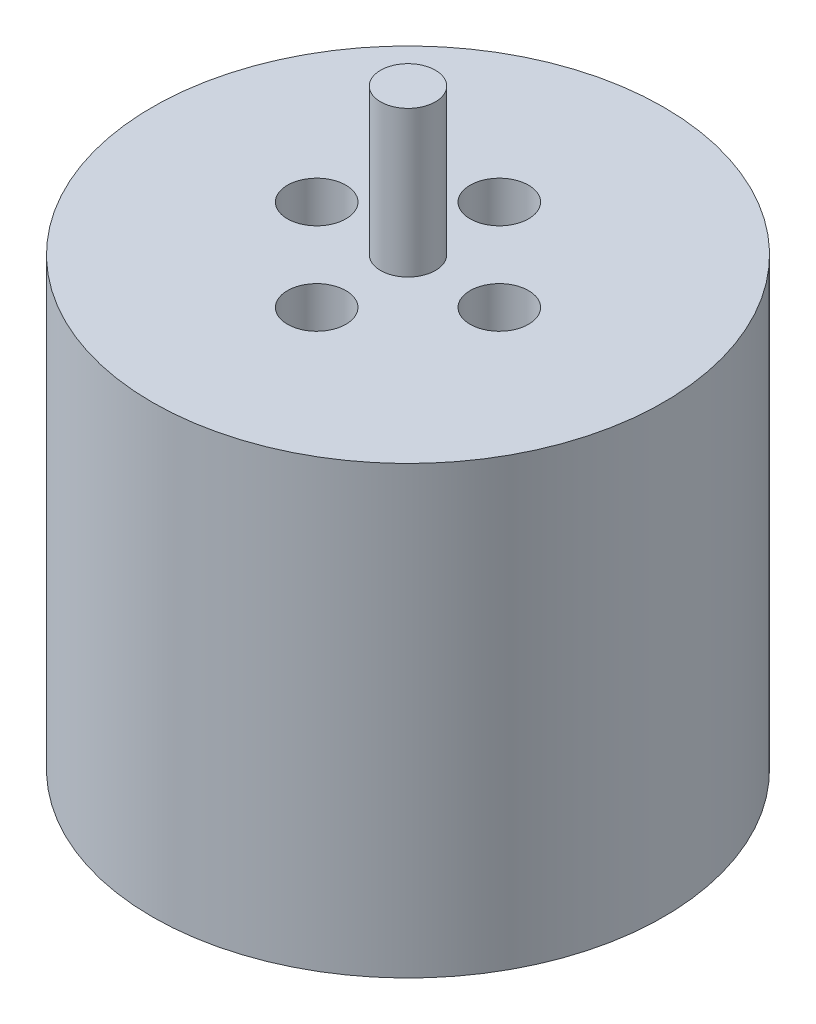
ISO-10303-21;
HEADER;
FILE_DESCRIPTION(('STEP AP214'),'2;1');
FILE_NAME('part.step','',(''),(''),'','','');
FILE_SCHEMA(('AUTOMOTIVE_DESIGN { 1 0 10303 214 1 1 1 1 }'));
ENDSEC;
DATA;
#1=APPLICATION_CONTEXT('core data for automotive mechanical design processes');
#2=APPLICATION_PROTOCOL_DEFINITION('international standard','automotive_design',2000,#1);
#3=PRODUCT_CONTEXT('',#1,'mechanical');
#4=PRODUCT('Part','Part','',(#3));
#5=PRODUCT_RELATED_PRODUCT_CATEGORY('part','',(#4));
#6=PRODUCT_DEFINITION_FORMATION('','',#4);
#7=PRODUCT_DEFINITION_CONTEXT('part definition',#1,'design');
#8=PRODUCT_DEFINITION('design','',#6,#7);
#9=PRODUCT_DEFINITION_SHAPE('','',#8);
#10=(LENGTH_UNIT() NAMED_UNIT(*) SI_UNIT(.MILLI.,.METRE.));
#11=(NAMED_UNIT(*) PLANE_ANGLE_UNIT() SI_UNIT($,.RADIAN.));
#12=(NAMED_UNIT(*) SI_UNIT($,.STERADIAN.) SOLID_ANGLE_UNIT());
#13=UNCERTAINTY_MEASURE_WITH_UNIT(LENGTH_MEASURE(1.E-05),#10,'distance_accuracy_value','');
#14=(GEOMETRIC_REPRESENTATION_CONTEXT(3) GLOBAL_UNCERTAINTY_ASSIGNED_CONTEXT((#13)) GLOBAL_UNIT_ASSIGNED_CONTEXT((#10,
#11,#12)) REPRESENTATION_CONTEXT('',''));
#15=CARTESIAN_POINT('',(0.,0.,0.));
#16=DIRECTION('',(0.,0.,1.));
#17=DIRECTION('',(1.,0.,0.));
#18=AXIS2_PLACEMENT_3D('',#15,#16,#17);
#19=CARTESIAN_POINT('',(0.,6.1,0.));
#20=DIRECTION('',(0.,-1.,0.));
#21=DIRECTION('',(0.,0.,-1.));
#22=AXIS2_PLACEMENT_3D('',#19,#20,#21);
#23=CYLINDRICAL_SURFACE('',#22,7.);
#24=CARTESIAN_POINT('',(0.,6.1,0.));
#25=DIRECTION('',(0.,1.,0.));
#26=DIRECTION('',(0.,0.,1.));
#27=AXIS2_PLACEMENT_3D('',#24,#25,#26);
#28=CIRCLE('',#27,7.);
#29=CARTESIAN_POINT('',(0.,6.1,7.));
#30=VERTEX_POINT('',#29);
#31=EDGE_CURVE('E37',#30,#30,#28,.T.);
#32=ORIENTED_EDGE('',*,*,#31,.F.);
#33=EDGE_LOOP('',(#32));
#34=FACE_BOUND('',#33,.T.);
#35=CARTESIAN_POINT('',(0.,-6.1,0.));
#36=DIRECTION('',(0.,1.,0.));
#37=DIRECTION('',(0.,0.,1.));
#38=AXIS2_PLACEMENT_3D('',#35,#36,#37);
#39=CIRCLE('',#38,7.);
#40=CARTESIAN_POINT('',(0.,-6.1,7.));
#41=VERTEX_POINT('',#40);
#42=EDGE_CURVE('E41',#41,#41,#39,.T.);
#43=ORIENTED_EDGE('',*,*,#42,.T.);
#44=EDGE_LOOP('',(#43));
#45=FACE_BOUND('',#44,.T.);
#46=ADVANCED_FACE('F31',(#34,#45),#23,.T.);
#47=CARTESIAN_POINT('',(0.,6.1,0.));
#48=DIRECTION('',(0.,1.,0.));
#49=DIRECTION('',(0.,0.,1.));
#50=AXIS2_PLACEMENT_3D('',#47,#48,#49);
#51=PLANE('',#50);
#52=CARTESIAN_POINT('',(2.5,6.1,0.));
#53=DIRECTION('',(0.,1.,0.));
#54=DIRECTION('',(0.,0.,1.));
#55=AXIS2_PLACEMENT_3D('',#52,#53,#54);
#56=CIRCLE('',#55,0.8);
#57=CARTESIAN_POINT('',(2.5,6.1,0.8));
#58=VERTEX_POINT('',#57);
#59=EDGE_CURVE('E99',#58,#58,#56,.T.);
#60=ORIENTED_EDGE('',*,*,#59,.F.);
#61=EDGE_LOOP('',(#60));
#62=FACE_BOUND('',#61,.T.);
#63=CARTESIAN_POINT('',(0.,6.1,2.5));
#64=DIRECTION('',(0.,1.,0.));
#65=DIRECTION('',(0.,0.,1.));
#66=AXIS2_PLACEMENT_3D('',#63,#64,#65);
#67=CIRCLE('',#66,0.8);
#68=CARTESIAN_POINT('',(0.,6.1,3.3));
#69=VERTEX_POINT('',#68);
#70=EDGE_CURVE('E93',#69,#69,#67,.T.);
#71=ORIENTED_EDGE('',*,*,#70,.F.);
#72=EDGE_LOOP('',(#71));
#73=FACE_BOUND('',#72,.T.);
#74=CARTESIAN_POINT('',(-2.5,6.1,0.));
#75=DIRECTION('',(0.,1.,0.));
#76=DIRECTION('',(0.,0.,1.));
#77=AXIS2_PLACEMENT_3D('',#74,#75,#76);
#78=CIRCLE('',#77,0.8);
#79=CARTESIAN_POINT('',(-2.5,6.1,0.8));
#80=VERTEX_POINT('',#79);
#81=EDGE_CURVE('E87',#80,#80,#78,.T.);
#82=ORIENTED_EDGE('',*,*,#81,.F.);
#83=EDGE_LOOP('',(#82));
#84=FACE_BOUND('',#83,.T.);
#85=CARTESIAN_POINT('',(0.,6.1,-2.5));
#86=DIRECTION('',(0.,1.,0.));
#87=DIRECTION('',(0.,0.,1.));
#88=AXIS2_PLACEMENT_3D('',#85,#86,#87);
#89=CIRCLE('',#88,0.8);
#90=CARTESIAN_POINT('',(0.,6.1,-1.7));
#91=VERTEX_POINT('',#90);
#92=EDGE_CURVE('E81',#91,#91,#89,.T.);
#93=ORIENTED_EDGE('',*,*,#92,.F.);
#94=EDGE_LOOP('',(#93));
#95=FACE_BOUND('',#94,.T.);
#96=CARTESIAN_POINT('',(0.,6.1,0.));
#97=DIRECTION('',(0.,1.,0.));
#98=DIRECTION('',(0.,0.,1.));
#99=AXIS2_PLACEMENT_3D('',#96,#97,#98);
#100=CIRCLE('',#99,0.75);
#101=CARTESIAN_POINT('',(0.,6.1,0.75));
#102=VERTEX_POINT('',#101);
#103=EDGE_CURVE('E51',#102,#102,#100,.T.);
#104=ORIENTED_EDGE('',*,*,#103,.F.);
#105=EDGE_LOOP('',(#104));
#106=FACE_BOUND('',#105,.T.);
#107=ORIENTED_EDGE('',*,*,#31,.T.);
#108=EDGE_LOOP('',(#107));
#109=FACE_BOUND('',#108,.T.);
#110=ADVANCED_FACE('F114',(#62,#73,#84,#95,#106,#109),#51,.T.);
#111=CARTESIAN_POINT('',(0.,-6.1,0.));
#112=DIRECTION('',(0.,1.,0.));
#113=DIRECTION('',(0.,0.,1.));
#114=AXIS2_PLACEMENT_3D('',#111,#112,#113);
#115=PLANE('',#114);
#116=CARTESIAN_POINT('',(0.,-6.1,4.5));
#117=DIRECTION('',(0.,-1.,0.));
#118=DIRECTION('',(0.,0.,-1.));
#119=AXIS2_PLACEMENT_3D('',#116,#117,#118);
#120=CIRCLE('',#119,0.8);
#121=CARTESIAN_POINT('',(0.,-6.1,3.7));
#122=VERTEX_POINT('',#121);
#123=EDGE_CURVE('E76',#122,#122,#120,.T.);
#124=ORIENTED_EDGE('',*,*,#123,.F.);
#125=EDGE_LOOP('',(#124));
#126=FACE_BOUND('',#125,.T.);
#127=CARTESIAN_POINT('',(4.5,-6.1,0.));
#128=DIRECTION('',(0.,-1.,0.));
#129=DIRECTION('',(0.,0.,-1.));
#130=AXIS2_PLACEMENT_3D('',#127,#128,#129);
#131=CIRCLE('',#130,0.800000000000001);
#132=CARTESIAN_POINT('',(4.5,-6.1,-0.800000000000001));
#133=VERTEX_POINT('',#132);
#134=EDGE_CURVE('E70',#133,#133,#131,.T.);
#135=ORIENTED_EDGE('',*,*,#134,.F.);
#136=EDGE_LOOP('',(#135));
#137=FACE_BOUND('',#136,.T.);
#138=CARTESIAN_POINT('',(0.,-6.1,-4.5));
#139=DIRECTION('',(0.,-1.,0.));
#140=DIRECTION('',(0.,0.,-1.));
#141=AXIS2_PLACEMENT_3D('',#138,#139,#140);
#142=CIRCLE('',#141,0.8);
#143=CARTESIAN_POINT('',(0.,-6.1,-5.3));
#144=VERTEX_POINT('',#143);
#145=EDGE_CURVE('E64',#144,#144,#142,.T.);
#146=ORIENTED_EDGE('',*,*,#145,.F.);
#147=EDGE_LOOP('',(#146));
#148=FACE_BOUND('',#147,.T.);
#149=CARTESIAN_POINT('',(-4.5,-6.1,0.));
#150=DIRECTION('',(0.,-1.,0.));
#151=DIRECTION('',(0.,0.,-1.));
#152=AXIS2_PLACEMENT_3D('',#149,#150,#151);
#153=CIRCLE('',#152,0.8);
#154=CARTESIAN_POINT('',(-4.5,-6.1,-0.8));
#155=VERTEX_POINT('',#154);
#156=EDGE_CURVE('E57',#155,#155,#153,.T.);
#157=ORIENTED_EDGE('',*,*,#156,.F.);
#158=EDGE_LOOP('',(#157));
#159=FACE_BOUND('',#158,.T.);
#160=CARTESIAN_POINT('',(0.,-6.1,0.));
#161=DIRECTION('',(0.,1.,0.));
#162=DIRECTION('',(0.,0.,1.));
#163=AXIS2_PLACEMENT_3D('',#160,#161,#162);
#164=CIRCLE('',#163,0.75);
#165=CARTESIAN_POINT('',(0.,-6.1,0.75));
#166=VERTEX_POINT('',#165);
#167=EDGE_CURVE('E10',#166,#166,#164,.F.);
#168=ORIENTED_EDGE('',*,*,#167,.F.);
#169=EDGE_LOOP('',(#168));
#170=FACE_BOUND('',#169,.T.);
#171=ORIENTED_EDGE('',*,*,#42,.F.);
#172=EDGE_LOOP('',(#171));
#173=FACE_BOUND('',#172,.T.);
#174=ADVANCED_FACE('F117',(#126,#137,#148,#159,#170,#173),#115,.F.);
#175=CARTESIAN_POINT('',(0.,-7.1,0.));
#176=DIRECTION('',(0.,1.,0.));
#177=DIRECTION('',(0.,0.,1.));
#178=AXIS2_PLACEMENT_3D('',#175,#176,#177);
#179=CYLINDRICAL_SURFACE('',#178,0.75);
#180=CARTESIAN_POINT('',(0.,-7.1,0.));
#181=DIRECTION('',(0.,-1.,0.));
#182=DIRECTION('',(0.,0.,-1.));
#183=AXIS2_PLACEMENT_3D('',#180,#181,#182);
#184=CIRCLE('',#183,0.75);
#185=CARTESIAN_POINT('',(0.,-7.1,-0.75));
#186=VERTEX_POINT('',#185);
#187=EDGE_CURVE('E46',#186,#186,#184,.T.);
#188=ORIENTED_EDGE('',*,*,#187,.F.);
#189=EDGE_LOOP('',(#188));
#190=FACE_BOUND('',#189,.T.);
#191=ORIENTED_EDGE('',*,*,#167,.T.);
#192=EDGE_LOOP('',(#191));
#193=FACE_BOUND('',#192,.T.);
#194=ADVANCED_FACE('F140',(#190,#193),#179,.T.);
#195=CARTESIAN_POINT('',(0.,-7.1,0.));
#196=DIRECTION('',(0.,-1.,0.));
#197=DIRECTION('',(0.,0.,-1.));
#198=AXIS2_PLACEMENT_3D('',#195,#196,#197);
#199=PLANE('',#198);
#200=ORIENTED_EDGE('',*,*,#187,.T.);
#201=EDGE_LOOP('',(#200));
#202=FACE_BOUND('',#201,.T.);
#203=ADVANCED_FACE('F130',(#202),#199,.T.);
#204=CARTESIAN_POINT('',(0.,10.1,0.));
#205=DIRECTION('',(0.,-1.,0.));
#206=DIRECTION('',(0.,0.,-1.));
#207=AXIS2_PLACEMENT_3D('',#204,#205,#206);
#208=CYLINDRICAL_SURFACE('',#207,0.75);
#209=CARTESIAN_POINT('',(0.,10.1,0.));
#210=DIRECTION('',(0.,1.,0.));
#211=DIRECTION('',(0.,0.,1.));
#212=AXIS2_PLACEMENT_3D('',#209,#210,#211);
#213=CIRCLE('',#212,0.75);
#214=CARTESIAN_POINT('',(0.,10.1,0.75));
#215=VERTEX_POINT('',#214);
#216=EDGE_CURVE('E50',#215,#215,#213,.T.);
#217=ORIENTED_EDGE('',*,*,#216,.F.);
#218=EDGE_LOOP('',(#217));
#219=FACE_BOUND('',#218,.T.);
#220=ORIENTED_EDGE('',*,*,#103,.T.);
#221=EDGE_LOOP('',(#220));
#222=FACE_BOUND('',#221,.T.);
#223=ADVANCED_FACE('F127',(#219,#222),#208,.T.);
#224=CARTESIAN_POINT('',(0.,10.1,0.));
#225=DIRECTION('',(0.,1.,0.));
#226=DIRECTION('',(0.,0.,1.));
#227=AXIS2_PLACEMENT_3D('',#224,#225,#226);
#228=PLANE('',#227);
#229=ORIENTED_EDGE('',*,*,#216,.T.);
#230=EDGE_LOOP('',(#229));
#231=FACE_BOUND('',#230,.T.);
#232=ADVANCED_FACE('F129',(#231),#228,.T.);
#233=CARTESIAN_POINT('',(-4.5,-4.1,0.));
#234=DIRECTION('',(0.,-1.,0.));
#235=DIRECTION('',(0.,0.,-1.));
#236=AXIS2_PLACEMENT_3D('',#233,#234,#235);
#237=CYLINDRICAL_SURFACE('',#236,0.8);
#238=CARTESIAN_POINT('',(-4.5,-4.1,0.));
#239=DIRECTION('',(0.,-1.,0.));
#240=DIRECTION('',(0.,0.,-1.));
#241=AXIS2_PLACEMENT_3D('',#238,#239,#240);
#242=CIRCLE('',#241,0.8);
#243=CARTESIAN_POINT('',(-4.5,-4.1,-0.8));
#244=VERTEX_POINT('',#243);
#245=EDGE_CURVE('E60',#244,#244,#242,.T.);
#246=ORIENTED_EDGE('',*,*,#245,.F.);
#247=EDGE_LOOP('',(#246));
#248=FACE_BOUND('',#247,.T.);
#249=ORIENTED_EDGE('',*,*,#156,.T.);
#250=EDGE_LOOP('',(#249));
#251=FACE_BOUND('',#250,.T.);
#252=ADVANCED_FACE('F137',(#248,#251),#237,.F.);
#253=CARTESIAN_POINT('',(-4.5,-4.1,0.));
#254=DIRECTION('',(0.,-1.,0.));
#255=DIRECTION('',(0.,0.,-1.));
#256=AXIS2_PLACEMENT_3D('',#253,#254,#255);
#257=PLANE('',#256);
#258=ORIENTED_EDGE('',*,*,#245,.T.);
#259=EDGE_LOOP('',(#258));
#260=FACE_BOUND('',#259,.T.);
#261=ADVANCED_FACE('F168',(#260),#257,.T.);
#262=CARTESIAN_POINT('',(0.,-4.1,-4.5));
#263=DIRECTION('',(0.,-1.,0.));
#264=DIRECTION('',(0.,0.,-1.));
#265=AXIS2_PLACEMENT_3D('',#262,#263,#264);
#266=CYLINDRICAL_SURFACE('',#265,0.8);
#267=CARTESIAN_POINT('',(0.,-4.1,-4.5));
#268=DIRECTION('',(0.,-1.,0.));
#269=DIRECTION('',(0.,0.,-1.));
#270=AXIS2_PLACEMENT_3D('',#267,#268,#269);
#271=CIRCLE('',#270,0.8);
#272=CARTESIAN_POINT('',(0.,-4.1,-5.3));
#273=VERTEX_POINT('',#272);
#274=EDGE_CURVE('E67',#273,#273,#271,.T.);
#275=ORIENTED_EDGE('',*,*,#274,.F.);
#276=EDGE_LOOP('',(#275));
#277=FACE_BOUND('',#276,.T.);
#278=ORIENTED_EDGE('',*,*,#145,.T.);
#279=EDGE_LOOP('',(#278));
#280=FACE_BOUND('',#279,.T.);
#281=ADVANCED_FACE('F174',(#277,#280),#266,.F.);
#282=CARTESIAN_POINT('',(0.,-4.1,-4.5));
#283=DIRECTION('',(0.,-1.,0.));
#284=DIRECTION('',(0.,0.,-1.));
#285=AXIS2_PLACEMENT_3D('',#282,#283,#284);
#286=PLANE('',#285);
#287=ORIENTED_EDGE('',*,*,#274,.T.);
#288=EDGE_LOOP('',(#287));
#289=FACE_BOUND('',#288,.T.);
#290=ADVANCED_FACE('F181',(#289),#286,.T.);
#291=CARTESIAN_POINT('',(4.5,-4.1,0.));
#292=DIRECTION('',(0.,-1.,0.));
#293=DIRECTION('',(0.,0.,-1.));
#294=AXIS2_PLACEMENT_3D('',#291,#292,#293);
#295=CYLINDRICAL_SURFACE('',#294,0.800000000000001);
#296=CARTESIAN_POINT('',(4.5,-4.1,0.));
#297=DIRECTION('',(0.,-1.,0.));
#298=DIRECTION('',(0.,0.,-1.));
#299=AXIS2_PLACEMENT_3D('',#296,#297,#298);
#300=CIRCLE('',#299,0.800000000000001);
#301=CARTESIAN_POINT('',(4.5,-4.1,-0.800000000000001));
#302=VERTEX_POINT('',#301);
#303=EDGE_CURVE('E73',#302,#302,#300,.T.);
#304=ORIENTED_EDGE('',*,*,#303,.F.);
#305=EDGE_LOOP('',(#304));
#306=FACE_BOUND('',#305,.T.);
#307=ORIENTED_EDGE('',*,*,#134,.T.);
#308=EDGE_LOOP('',(#307));
#309=FACE_BOUND('',#308,.T.);
#310=ADVANCED_FACE('F185',(#306,#309),#295,.F.);
#311=CARTESIAN_POINT('',(4.5,-4.1,0.));
#312=DIRECTION('',(0.,-1.,0.));
#313=DIRECTION('',(0.,0.,-1.));
#314=AXIS2_PLACEMENT_3D('',#311,#312,#313);
#315=PLANE('',#314);
#316=ORIENTED_EDGE('',*,*,#303,.T.);
#317=EDGE_LOOP('',(#316));
#318=FACE_BOUND('',#317,.T.);
#319=ADVANCED_FACE('F189',(#318),#315,.T.);
#320=CARTESIAN_POINT('',(0.,-4.1,4.5));
#321=DIRECTION('',(0.,-1.,0.));
#322=DIRECTION('',(0.,0.,-1.));
#323=AXIS2_PLACEMENT_3D('',#320,#321,#322);
#324=CYLINDRICAL_SURFACE('',#323,0.8);
#325=CARTESIAN_POINT('',(0.,-4.1,4.5));
#326=DIRECTION('',(0.,-1.,0.));
#327=DIRECTION('',(0.,0.,-1.));
#328=AXIS2_PLACEMENT_3D('',#325,#326,#327);
#329=CIRCLE('',#328,0.8);
#330=CARTESIAN_POINT('',(0.,-4.1,3.7));
#331=VERTEX_POINT('',#330);
#332=EDGE_CURVE('E54',#331,#331,#329,.T.);
#333=ORIENTED_EDGE('',*,*,#332,.F.);
#334=EDGE_LOOP('',(#333));
#335=FACE_BOUND('',#334,.T.);
#336=ORIENTED_EDGE('',*,*,#123,.T.);
#337=EDGE_LOOP('',(#336));
#338=FACE_BOUND('',#337,.T.);
#339=ADVANCED_FACE('F193',(#335,#338),#324,.F.);
#340=CARTESIAN_POINT('',(0.,-4.1,4.5));
#341=DIRECTION('',(0.,-1.,0.));
#342=DIRECTION('',(0.,0.,-1.));
#343=AXIS2_PLACEMENT_3D('',#340,#341,#342);
#344=PLANE('',#343);
#345=ORIENTED_EDGE('',*,*,#332,.T.);
#346=EDGE_LOOP('',(#345));
#347=FACE_BOUND('',#346,.T.);
#348=ADVANCED_FACE('F197',(#347),#344,.T.);
#349=CARTESIAN_POINT('',(0.,4.1,-2.5));
#350=DIRECTION('',(0.,1.,0.));
#351=DIRECTION('',(0.,0.,1.));
#352=AXIS2_PLACEMENT_3D('',#349,#350,#351);
#353=CYLINDRICAL_SURFACE('',#352,0.8);
#354=CARTESIAN_POINT('',(0.,4.1,-2.5));
#355=DIRECTION('',(0.,1.,0.));
#356=DIRECTION('',(0.,0.,1.));
#357=AXIS2_PLACEMENT_3D('',#354,#355,#356);
#358=CIRCLE('',#357,0.8);
#359=CARTESIAN_POINT('',(0.,4.1,-1.7));
#360=VERTEX_POINT('',#359);
#361=EDGE_CURVE('E84',#360,#360,#358,.T.);
#362=ORIENTED_EDGE('',*,*,#361,.F.);
#363=EDGE_LOOP('',(#362));
#364=FACE_BOUND('',#363,.T.);
#365=ORIENTED_EDGE('',*,*,#92,.T.);
#366=EDGE_LOOP('',(#365));
#367=FACE_BOUND('',#366,.T.);
#368=ADVANCED_FACE('F201',(#364,#367),#353,.F.);
#369=CARTESIAN_POINT('',(0.,4.1,-2.5));
#370=DIRECTION('',(0.,1.,0.));
#371=DIRECTION('',(0.,0.,1.));
#372=AXIS2_PLACEMENT_3D('',#369,#370,#371);
#373=PLANE('',#372);
#374=ORIENTED_EDGE('',*,*,#361,.T.);
#375=EDGE_LOOP('',(#374));
#376=FACE_BOUND('',#375,.T.);
#377=ADVANCED_FACE('F205',(#376),#373,.T.);
#378=CARTESIAN_POINT('',(-2.5,4.1,0.));
#379=DIRECTION('',(0.,1.,0.));
#380=DIRECTION('',(0.,0.,1.));
#381=AXIS2_PLACEMENT_3D('',#378,#379,#380);
#382=CYLINDRICAL_SURFACE('',#381,0.8);
#383=CARTESIAN_POINT('',(-2.5,4.1,0.));
#384=DIRECTION('',(0.,1.,0.));
#385=DIRECTION('',(0.,0.,1.));
#386=AXIS2_PLACEMENT_3D('',#383,#384,#385);
#387=CIRCLE('',#386,0.8);
#388=CARTESIAN_POINT('',(-2.5,4.1,0.8));
#389=VERTEX_POINT('',#388);
#390=EDGE_CURVE('E90',#389,#389,#387,.T.);
#391=ORIENTED_EDGE('',*,*,#390,.F.);
#392=EDGE_LOOP('',(#391));
#393=FACE_BOUND('',#392,.T.);
#394=ORIENTED_EDGE('',*,*,#81,.T.);
#395=EDGE_LOOP('',(#394));
#396=FACE_BOUND('',#395,.T.);
#397=ADVANCED_FACE('F209',(#393,#396),#382,.F.);
#398=CARTESIAN_POINT('',(-2.5,4.1,0.));
#399=DIRECTION('',(0.,1.,0.));
#400=DIRECTION('',(0.,0.,1.));
#401=AXIS2_PLACEMENT_3D('',#398,#399,#400);
#402=PLANE('',#401);
#403=ORIENTED_EDGE('',*,*,#390,.T.);
#404=EDGE_LOOP('',(#403));
#405=FACE_BOUND('',#404,.T.);
#406=ADVANCED_FACE('F213',(#405),#402,.T.);
#407=CARTESIAN_POINT('',(0.,4.1,2.5));
#408=DIRECTION('',(0.,1.,0.));
#409=DIRECTION('',(0.,0.,1.));
#410=AXIS2_PLACEMENT_3D('',#407,#408,#409);
#411=CYLINDRICAL_SURFACE('',#410,0.8);
#412=CARTESIAN_POINT('',(0.,4.1,2.5));
#413=DIRECTION('',(0.,1.,0.));
#414=DIRECTION('',(0.,0.,1.));
#415=AXIS2_PLACEMENT_3D('',#412,#413,#414);
#416=CIRCLE('',#415,0.8);
#417=CARTESIAN_POINT('',(0.,4.1,3.3));
#418=VERTEX_POINT('',#417);
#419=EDGE_CURVE('E96',#418,#418,#416,.T.);
#420=ORIENTED_EDGE('',*,*,#419,.F.);
#421=EDGE_LOOP('',(#420));
#422=FACE_BOUND('',#421,.T.);
#423=ORIENTED_EDGE('',*,*,#70,.T.);
#424=EDGE_LOOP('',(#423));
#425=FACE_BOUND('',#424,.T.);
#426=ADVANCED_FACE('F217',(#422,#425),#411,.F.);
#427=CARTESIAN_POINT('',(0.,4.1,2.5));
#428=DIRECTION('',(0.,1.,0.));
#429=DIRECTION('',(0.,0.,1.));
#430=AXIS2_PLACEMENT_3D('',#427,#428,#429);
#431=PLANE('',#430);
#432=ORIENTED_EDGE('',*,*,#419,.T.);
#433=EDGE_LOOP('',(#432));
#434=FACE_BOUND('',#433,.T.);
#435=ADVANCED_FACE('F110',(#434),#431,.T.);
#436=CARTESIAN_POINT('',(2.5,4.1,0.));
#437=DIRECTION('',(0.,1.,0.));
#438=DIRECTION('',(0.,0.,1.));
#439=AXIS2_PLACEMENT_3D('',#436,#437,#438);
#440=CYLINDRICAL_SURFACE('',#439,0.8);
#441=CARTESIAN_POINT('',(2.5,4.1,0.));
#442=DIRECTION('',(0.,1.,0.));
#443=DIRECTION('',(0.,0.,1.));
#444=AXIS2_PLACEMENT_3D('',#441,#442,#443);
#445=CIRCLE('',#444,0.8);
#446=CARTESIAN_POINT('',(2.5,4.1,0.8));
#447=VERTEX_POINT('',#446);
#448=EDGE_CURVE('E61',#447,#447,#445,.T.);
#449=ORIENTED_EDGE('',*,*,#448,.F.);
#450=EDGE_LOOP('',(#449));
#451=FACE_BOUND('',#450,.T.);
#452=ORIENTED_EDGE('',*,*,#59,.T.);
#453=EDGE_LOOP('',(#452));
#454=FACE_BOUND('',#453,.T.);
#455=ADVANCED_FACE('F107',(#451,#454),#440,.F.);
#456=CARTESIAN_POINT('',(2.5,4.1,0.));
#457=DIRECTION('',(0.,1.,0.));
#458=DIRECTION('',(0.,0.,1.));
#459=AXIS2_PLACEMENT_3D('',#456,#457,#458);
#460=PLANE('',#459);
#461=ORIENTED_EDGE('',*,*,#448,.T.);
#462=EDGE_LOOP('',(#461));
#463=FACE_BOUND('',#462,.T.);
#464=ADVANCED_FACE('F105',(#463),#460,.T.);
#465=CLOSED_SHELL('',(#46,#110,#174,#194,#203,#223,#232,#252,#261,#281,#290,#310,#319,#339,#348,
#368,#377,#397,#406,#426,#435,#455,#464));
#466=MANIFOLD_SOLID_BREP('B2',#465);
#467=ADVANCED_BREP_SHAPE_REPRESENTATION('',(#18,#466),#14);
#468=SHAPE_DEFINITION_REPRESENTATION(#9,#467);
ENDSEC;
END-ISO-10303-21;
